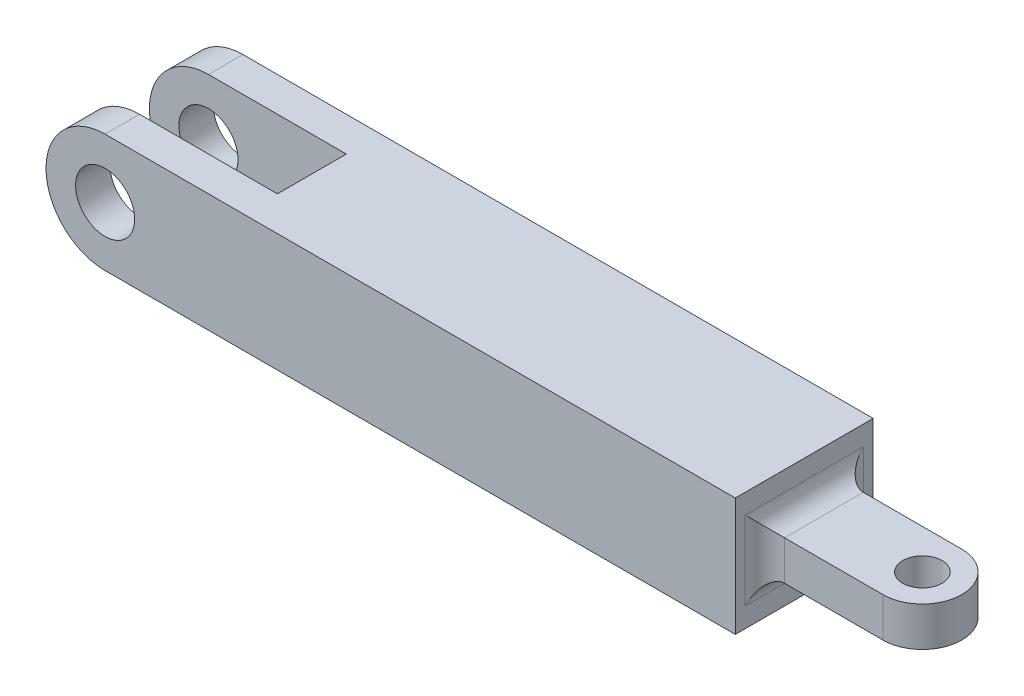
ISO-10303-21;
HEADER;
FILE_DESCRIPTION(('STEP AP214'),'2;1');
FILE_NAME('part.step','',(''),(''),'','','');
FILE_SCHEMA(('AUTOMOTIVE_DESIGN { 1 0 10303 214 1 1 1 1 }'));
ENDSEC;
DATA;
#1=APPLICATION_CONTEXT('core data for automotive mechanical design processes');
#2=APPLICATION_PROTOCOL_DEFINITION('international standard','automotive_design',2000,#1);
#3=PRODUCT_CONTEXT('',#1,'mechanical');
#4=PRODUCT('Part','Part','',(#3));
#5=PRODUCT_RELATED_PRODUCT_CATEGORY('part','',(#4));
#6=PRODUCT_DEFINITION_FORMATION('','',#4);
#7=PRODUCT_DEFINITION_CONTEXT('part definition',#1,'design');
#8=PRODUCT_DEFINITION('design','',#6,#7);
#9=PRODUCT_DEFINITION_SHAPE('','',#8);
#10=(LENGTH_UNIT() NAMED_UNIT(*) SI_UNIT(.MILLI.,.METRE.));
#11=(NAMED_UNIT(*) PLANE_ANGLE_UNIT() SI_UNIT($,.RADIAN.));
#12=(NAMED_UNIT(*) SI_UNIT($,.STERADIAN.) SOLID_ANGLE_UNIT());
#13=UNCERTAINTY_MEASURE_WITH_UNIT(LENGTH_MEASURE(1.E-05),#10,'distance_accuracy_value','');
#14=(GEOMETRIC_REPRESENTATION_CONTEXT(3) GLOBAL_UNCERTAINTY_ASSIGNED_CONTEXT((#13)) GLOBAL_UNIT_ASSIGNED_CONTEXT((#10,
#11,#12)) REPRESENTATION_CONTEXT('',''));
#15=CARTESIAN_POINT('',(0.,0.,0.));
#16=DIRECTION('',(0.,0.,1.));
#17=DIRECTION('',(1.,0.,0.));
#18=AXIS2_PLACEMENT_3D('',#15,#16,#17);
#19=CARTESIAN_POINT('',(-64.,6.,7.));
#20=DIRECTION('',(0.,0.,-1.));
#21=DIRECTION('',(-1.,0.,0.));
#22=AXIS2_PLACEMENT_3D('',#19,#20,#21);
#23=CYLINDRICAL_SURFACE('',#22,6.);
#24=CARTESIAN_POINT('',(-64.,6.,3.5));
#25=DIRECTION('',(0.,0.,-1.));
#26=DIRECTION('',(-1.,0.,0.));
#27=AXIS2_PLACEMENT_3D('',#24,#25,#26);
#28=CIRCLE('',#27,6.);
#29=CARTESIAN_POINT('',(-64.,0.,3.5));
#30=VERTEX_POINT('',#29);
#31=CARTESIAN_POINT('',(-64.,12.,3.5));
#32=VERTEX_POINT('',#31);
#33=EDGE_CURVE('E164',#30,#32,#28,.T.);
#34=ORIENTED_EDGE('',*,*,#33,.F.);
#35=DIRECTION('',(0.,0.,-1.));
#36=VECTOR('',#35,1.);
#37=CARTESIAN_POINT('',(-64.,0.,7.));
#38=LINE('',#37,#36);
#39=CARTESIAN_POINT('',(-64.,0.,7.));
#40=VERTEX_POINT('',#39);
#41=EDGE_CURVE('E217',#40,#30,#38,.T.);
#42=ORIENTED_EDGE('',*,*,#41,.F.);
#43=CARTESIAN_POINT('',(-64.,6.,7.));
#44=DIRECTION('',(0.,0.,1.));
#45=DIRECTION('',(1.,0.,0.));
#46=AXIS2_PLACEMENT_3D('',#43,#44,#45);
#47=CIRCLE('',#46,6.);
#48=CARTESIAN_POINT('',(-64.,12.,7.));
#49=VERTEX_POINT('',#48);
#50=EDGE_CURVE('E205',#49,#40,#47,.T.);
#51=ORIENTED_EDGE('',*,*,#50,.F.);
#52=DIRECTION('',(0.,0.,-1.));
#53=VECTOR('',#52,1.);
#54=CARTESIAN_POINT('',(-64.,12.,7.));
#55=LINE('',#54,#53);
#56=EDGE_CURVE('E221',#49,#32,#55,.T.);
#57=ORIENTED_EDGE('',*,*,#56,.T.);
#58=EDGE_LOOP('',(#34,#42,#51,#57));
#59=FACE_BOUND('',#58,.T.);
#60=ADVANCED_FACE('F43',(#59),#23,.T.);
#61=CARTESIAN_POINT('',(12.,4.,0.));
#62=DIRECTION('',(0.,1.,0.));
#63=DIRECTION('',(0.,0.,1.));
#64=AXIS2_PLACEMENT_3D('',#61,#62,#63);
#65=CYLINDRICAL_SURFACE('',#64,4.);
#66=DIRECTION('',(0.,1.,0.));
#67=VECTOR('',#66,1.);
#68=CARTESIAN_POINT('',(12.,4.,4.));
#69=LINE('',#68,#67);
#70=CARTESIAN_POINT('',(12.,4.,4.));
#71=VERTEX_POINT('',#70);
#72=CARTESIAN_POINT('',(12.,8.00000000000001,4.));
#73=VERTEX_POINT('',#72);
#74=EDGE_CURVE('E229',#71,#73,#69,.T.);
#75=ORIENTED_EDGE('',*,*,#74,.F.);
#76=CARTESIAN_POINT('',(12.,4.,0.));
#77=DIRECTION('',(0.,1.,0.));
#78=DIRECTION('',(0.,0.,1.));
#79=AXIS2_PLACEMENT_3D('',#76,#77,#78);
#80=CIRCLE('',#79,4.);
#81=CARTESIAN_POINT('',(12.,4.,-4.));
#82=VERTEX_POINT('',#81);
#83=EDGE_CURVE('E235',#82,#71,#80,.F.);
#84=ORIENTED_EDGE('',*,*,#83,.F.);
#85=DIRECTION('',(0.,-1.,0.));
#86=VECTOR('',#85,1.);
#87=CARTESIAN_POINT('',(12.,4.,-4.));
#88=LINE('',#87,#86);
#89=CARTESIAN_POINT('',(12.,8.00000000000001,-4.));
#90=VERTEX_POINT('',#89);
#91=EDGE_CURVE('E232',#90,#82,#88,.T.);
#92=ORIENTED_EDGE('',*,*,#91,.F.);
#93=CARTESIAN_POINT('',(12.,8.00000000000001,0.));
#94=DIRECTION('',(0.,1.,0.));
#95=DIRECTION('',(0.,0.,1.));
#96=AXIS2_PLACEMENT_3D('',#93,#94,#95);
#97=CIRCLE('',#96,4.);
#98=EDGE_CURVE('E237',#73,#90,#97,.T.);
#99=ORIENTED_EDGE('',*,*,#98,.F.);
#100=EDGE_LOOP('',(#75,#84,#92,#99));
#101=FACE_BOUND('',#100,.T.);
#102=ADVANCED_FACE('F326',(#101),#65,.T.);
#103=CARTESIAN_POINT('',(-64.,0.,7.));
#104=DIRECTION('',(0.,1.,0.));
#105=DIRECTION('',(0.,0.,1.));
#106=AXIS2_PLACEMENT_3D('',#103,#104,#105);
#107=PLANE('',#106);
#108=DIRECTION('',(0.,0.,-1.));
#109=VECTOR('',#108,1.);
#110=CARTESIAN_POINT('',(-50.,0.,7.));
#111=LINE('',#110,#109);
#112=CARTESIAN_POINT('',(-50.,0.,3.5));
#113=VERTEX_POINT('',#112);
#114=CARTESIAN_POINT('',(-50.,0.,-3.5));
#115=VERTEX_POINT('',#114);
#116=EDGE_CURVE('E154',#113,#115,#111,.T.);
#117=ORIENTED_EDGE('',*,*,#116,.T.);
#118=DIRECTION('',(-1.,0.,0.));
#119=VECTOR('',#118,1.);
#120=CARTESIAN_POINT('',(-64.,0.,-3.5));
#121=LINE('',#120,#119);
#122=CARTESIAN_POINT('',(-64.,0.,-3.5));
#123=VERTEX_POINT('',#122);
#124=EDGE_CURVE('E179',#115,#123,#121,.T.);
#125=ORIENTED_EDGE('',*,*,#124,.T.);
#126=CARTESIAN_POINT('',(-64.,0.,-7.));
#127=VERTEX_POINT('',#126);
#128=EDGE_CURVE('E207',#123,#127,#38,.T.);
#129=ORIENTED_EDGE('',*,*,#128,.T.);
#130=DIRECTION('',(1.,0.,0.));
#131=VECTOR('',#130,1.);
#132=CARTESIAN_POINT('',(-64.,0.,-7.));
#133=LINE('',#132,#131);
#134=CARTESIAN_POINT('',(0.,0.,-7.));
#135=VERTEX_POINT('',#134);
#136=EDGE_CURVE('E190',#127,#135,#133,.T.);
#137=ORIENTED_EDGE('',*,*,#136,.T.);
#138=DIRECTION('',(0.,0.,-1.));
#139=VECTOR('',#138,1.);
#140=CARTESIAN_POINT('',(0.,0.,7.));
#141=LINE('',#140,#139);
#142=CARTESIAN_POINT('',(0.,0.,7.));
#143=VERTEX_POINT('',#142);
#144=EDGE_CURVE('E226',#143,#135,#141,.T.);
#145=ORIENTED_EDGE('',*,*,#144,.F.);
#146=DIRECTION('',(1.,0.,0.));
#147=VECTOR('',#146,1.);
#148=CARTESIAN_POINT('',(-64.,0.,7.));
#149=LINE('',#148,#147);
#150=EDGE_CURVE('E197',#40,#143,#149,.T.);
#151=ORIENTED_EDGE('',*,*,#150,.F.);
#152=ORIENTED_EDGE('',*,*,#41,.T.);
#153=DIRECTION('',(-1.,0.,0.));
#154=VECTOR('',#153,1.);
#155=CARTESIAN_POINT('',(-64.,0.,3.5));
#156=LINE('',#155,#154);
#157=EDGE_CURVE('E176',#113,#30,#156,.T.);
#158=ORIENTED_EDGE('',*,*,#157,.F.);
#159=EDGE_LOOP('',(#117,#125,#129,#137,#145,#151,#152,#158));
#160=FACE_BOUND('',#159,.T.);
#161=ADVANCED_FACE('F302',(#160),#107,.F.);
#162=CARTESIAN_POINT('',(0.,0.,7.));
#163=DIRECTION('',(-1.,0.,0.));
#164=DIRECTION('',(0.,0.,1.));
#165=AXIS2_PLACEMENT_3D('',#162,#163,#164);
#166=PLANE('',#165);
#167=DIRECTION('',(0.,0.,-1.));
#168=VECTOR('',#167,1.);
#169=CARTESIAN_POINT('',(0.,2.,4.));
#170=LINE('',#169,#168);
#171=CARTESIAN_POINT('',(0.,2.,-6.));
#172=VERTEX_POINT('',#171);
#173=CARTESIAN_POINT('',(0.,2.,6.));
#174=VERTEX_POINT('',#173);
#175=EDGE_CURVE('E245',#172,#174,#170,.F.);
#176=ORIENTED_EDGE('',*,*,#175,.T.);
#177=DIRECTION('',(0.,1.,0.));
#178=VECTOR('',#177,1.);
#179=CARTESIAN_POINT('',(0.,0.,6.));
#180=LINE('',#179,#178);
#181=CARTESIAN_POINT('',(0.,10.,6.));
#182=VERTEX_POINT('',#181);
#183=EDGE_CURVE('E256',#174,#182,#180,.T.);
#184=ORIENTED_EDGE('',*,*,#183,.T.);
#185=DIRECTION('',(0.,0.,-1.));
#186=VECTOR('',#185,1.);
#187=CARTESIAN_POINT('',(0.,10.,7.));
#188=LINE('',#187,#186);
#189=CARTESIAN_POINT('',(0.,10.,-6.));
#190=VERTEX_POINT('',#189);
#191=EDGE_CURVE('E254',#182,#190,#188,.T.);
#192=ORIENTED_EDGE('',*,*,#191,.T.);
#193=DIRECTION('',(0.,1.,0.));
#194=VECTOR('',#193,1.);
#195=CARTESIAN_POINT('',(0.,4.,-6.));
#196=LINE('',#195,#194);
#197=EDGE_CURVE('E252',#190,#172,#196,.F.);
#198=ORIENTED_EDGE('',*,*,#197,.T.);
#199=EDGE_LOOP('',(#176,#184,#192,#198));
#200=FACE_BOUND('',#199,.T.);
#201=DIRECTION('',(0.,1.,0.));
#202=VECTOR('',#201,1.);
#203=CARTESIAN_POINT('',(0.,0.,-7.));
#204=LINE('',#203,#202);
#205=CARTESIAN_POINT('',(0.,12.,-7.));
#206=VERTEX_POINT('',#205);
#207=EDGE_CURVE('E210',#135,#206,#204,.T.);
#208=ORIENTED_EDGE('',*,*,#207,.T.);
#209=DIRECTION('',(0.,0.,-1.));
#210=VECTOR('',#209,1.);
#211=CARTESIAN_POINT('',(0.,12.,7.));
#212=LINE('',#211,#210);
#213=CARTESIAN_POINT('',(0.,12.,7.));
#214=VERTEX_POINT('',#213);
#215=EDGE_CURVE('E223',#214,#206,#212,.T.);
#216=ORIENTED_EDGE('',*,*,#215,.F.);
#217=DIRECTION('',(0.,1.,0.));
#218=VECTOR('',#217,1.);
#219=CARTESIAN_POINT('',(0.,0.,7.));
#220=LINE('',#219,#218);
#221=EDGE_CURVE('E200',#143,#214,#220,.T.);
#222=ORIENTED_EDGE('',*,*,#221,.F.);
#223=ORIENTED_EDGE('',*,*,#144,.T.);
#224=EDGE_LOOP('',(#208,#216,#222,#223));
#225=FACE_BOUND('',#224,.T.);
#226=ADVANCED_FACE('F305',(#200,#225),#166,.F.);
#227=CARTESIAN_POINT('',(0.,12.,7.));
#228=DIRECTION('',(0.,-1.,0.));
#229=DIRECTION('',(1.,0.,0.));
#230=AXIS2_PLACEMENT_3D('',#227,#228,#229);
#231=PLANE('',#230);
#232=CARTESIAN_POINT('',(-64.,12.,-3.5));
#233=VERTEX_POINT('',#232);
#234=CARTESIAN_POINT('',(-64.,12.,-7.));
#235=VERTEX_POINT('',#234);
#236=EDGE_CURVE('E220',#233,#235,#55,.T.);
#237=ORIENTED_EDGE('',*,*,#236,.F.);
#238=DIRECTION('',(-1.,0.,0.));
#239=VECTOR('',#238,1.);
#240=CARTESIAN_POINT('',(0.,12.,-3.5));
#241=LINE('',#240,#239);
#242=CARTESIAN_POINT('',(-50.,12.,-3.5));
#243=VERTEX_POINT('',#242);
#244=EDGE_CURVE('E158',#243,#233,#241,.T.);
#245=ORIENTED_EDGE('',*,*,#244,.F.);
#246=DIRECTION('',(0.,0.,-1.));
#247=VECTOR('',#246,1.);
#248=CARTESIAN_POINT('',(-50.,12.,0.));
#249=LINE('',#248,#247);
#250=CARTESIAN_POINT('',(-50.,12.,3.5));
#251=VERTEX_POINT('',#250);
#252=EDGE_CURVE('E151',#251,#243,#249,.T.);
#253=ORIENTED_EDGE('',*,*,#252,.F.);
#254=DIRECTION('',(-1.,0.,0.));
#255=VECTOR('',#254,1.);
#256=CARTESIAN_POINT('',(0.,12.,3.5));
#257=LINE('',#256,#255);
#258=EDGE_CURVE('E161',#251,#32,#257,.T.);
#259=ORIENTED_EDGE('',*,*,#258,.T.);
#260=ORIENTED_EDGE('',*,*,#56,.F.);
#261=DIRECTION('',(-1.,0.,0.));
#262=VECTOR('',#261,1.);
#263=CARTESIAN_POINT('',(0.,12.,7.));
#264=LINE('',#263,#262);
#265=EDGE_CURVE('E203',#214,#49,#264,.T.);
#266=ORIENTED_EDGE('',*,*,#265,.F.);
#267=ORIENTED_EDGE('',*,*,#215,.T.);
#268=DIRECTION('',(-1.,0.,0.));
#269=VECTOR('',#268,1.);
#270=CARTESIAN_POINT('',(0.,12.,-7.));
#271=LINE('',#270,#269);
#272=EDGE_CURVE('E212',#206,#235,#271,.T.);
#273=ORIENTED_EDGE('',*,*,#272,.T.);
#274=EDGE_LOOP('',(#237,#245,#253,#259,#260,#266,#267,#273));
#275=FACE_BOUND('',#274,.T.);
#276=ADVANCED_FACE('F171',(#275),#231,.F.);
#277=ORIENTED_EDGE('',*,*,#128,.F.);
#278=CARTESIAN_POINT('',(-64.,6.,-3.5));
#279=DIRECTION('',(0.,0.,-1.));
#280=DIRECTION('',(-1.,0.,0.));
#281=AXIS2_PLACEMENT_3D('',#278,#279,#280);
#282=CIRCLE('',#281,6.);
#283=EDGE_CURVE('E242',#123,#233,#282,.T.);
#284=ORIENTED_EDGE('',*,*,#283,.T.);
#285=ORIENTED_EDGE('',*,*,#236,.T.);
#286=CARTESIAN_POINT('',(-64.,6.,-7.));
#287=DIRECTION('',(0.,0.,1.));
#288=DIRECTION('',(1.,0.,0.));
#289=AXIS2_PLACEMENT_3D('',#286,#287,#288);
#290=CIRCLE('',#289,6.);
#291=EDGE_CURVE('E201',#235,#127,#290,.T.);
#292=ORIENTED_EDGE('',*,*,#291,.T.);
#293=EDGE_LOOP('',(#277,#284,#285,#292));
#294=FACE_BOUND('',#293,.T.);
#295=ADVANCED_FACE('F294',(#294),#23,.T.);
#296=CARTESIAN_POINT('',(-64.,6.,7.));
#297=DIRECTION('',(0.,0.,1.));
#298=DIRECTION('',(1.,0.,0.));
#299=AXIS2_PLACEMENT_3D('',#296,#297,#298);
#300=PLANE('',#299);
#301=CARTESIAN_POINT('',(-64.,6.,7.));
#302=DIRECTION('',(0.,0.,1.));
#303=DIRECTION('',(1.,0.,0.));
#304=AXIS2_PLACEMENT_3D('',#301,#302,#303);
#305=CIRCLE('',#304,3.);
#306=CARTESIAN_POINT('',(-61.,6.,7.));
#307=VERTEX_POINT('',#306);
#308=EDGE_CURVE('E168',#307,#307,#305,.T.);
#309=ORIENTED_EDGE('',*,*,#308,.F.);
#310=EDGE_LOOP('',(#309));
#311=FACE_BOUND('',#310,.T.);
#312=ORIENTED_EDGE('',*,*,#150,.T.);
#313=ORIENTED_EDGE('',*,*,#221,.T.);
#314=ORIENTED_EDGE('',*,*,#265,.T.);
#315=ORIENTED_EDGE('',*,*,#50,.T.);
#316=EDGE_LOOP('',(#312,#313,#314,#315));
#317=FACE_BOUND('',#316,.T.);
#318=ADVANCED_FACE('F290',(#311,#317),#300,.T.);
#319=CARTESIAN_POINT('',(-64.,6.,-7.));
#320=DIRECTION('',(0.,0.,1.));
#321=DIRECTION('',(1.,0.,0.));
#322=AXIS2_PLACEMENT_3D('',#319,#320,#321);
#323=PLANE('',#322);
#324=CARTESIAN_POINT('',(-64.,6.,-7.));
#325=DIRECTION('',(0.,0.,1.));
#326=DIRECTION('',(1.,0.,0.));
#327=AXIS2_PLACEMENT_3D('',#324,#325,#326);
#328=CIRCLE('',#327,3.);
#329=CARTESIAN_POINT('',(-61.,6.,-7.));
#330=VERTEX_POINT('',#329);
#331=EDGE_CURVE('E250',#330,#330,#328,.T.);
#332=ORIENTED_EDGE('',*,*,#331,.T.);
#333=EDGE_LOOP('',(#332));
#334=FACE_BOUND('',#333,.T.);
#335=ORIENTED_EDGE('',*,*,#136,.F.);
#336=ORIENTED_EDGE('',*,*,#291,.F.);
#337=ORIENTED_EDGE('',*,*,#272,.F.);
#338=ORIENTED_EDGE('',*,*,#207,.F.);
#339=EDGE_LOOP('',(#335,#336,#337,#338));
#340=FACE_BOUND('',#339,.T.);
#341=ADVANCED_FACE('F293',(#334,#340),#323,.F.);
#342=CARTESIAN_POINT('',(16.,8.00000000000001,4.));
#343=DIRECTION('',(0.,1.,0.));
#344=DIRECTION('',(0.,0.,1.));
#345=AXIS2_PLACEMENT_3D('',#342,#343,#344);
#346=PLANE('',#345);
#347=CARTESIAN_POINT('',(12.,8.00000000000001,0.));
#348=DIRECTION('',(0.,1.,0.));
#349=DIRECTION('',(0.,0.,1.));
#350=AXIS2_PLACEMENT_3D('',#347,#348,#349);
#351=CIRCLE('',#350,2.);
#352=CARTESIAN_POINT('',(12.,8.00000000000001,2.));
#353=VERTEX_POINT('',#352);
#354=EDGE_CURVE('E183',#353,#353,#351,.T.);
#355=ORIENTED_EDGE('',*,*,#354,.F.);
#356=EDGE_LOOP('',(#355));
#357=FACE_BOUND('',#356,.T.);
#358=DIRECTION('',(-1.,0.,0.));
#359=VECTOR('',#358,1.);
#360=CARTESIAN_POINT('',(16.,8.00000000000001,-4.));
#361=LINE('',#360,#359);
#362=CARTESIAN_POINT('',(2.,8.00000000000001,-4.));
#363=VERTEX_POINT('',#362);
#364=EDGE_CURVE('E195',#90,#363,#361,.T.);
#365=ORIENTED_EDGE('',*,*,#364,.T.);
#366=DIRECTION('',(0.,0.,-1.));
#367=VECTOR('',#366,1.);
#368=CARTESIAN_POINT('',(2.,8.00000000000001,4.));
#369=LINE('',#368,#367);
#370=CARTESIAN_POINT('',(2.,8.00000000000001,4.));
#371=VERTEX_POINT('',#370);
#372=EDGE_CURVE('E262',#363,#371,#369,.F.);
#373=ORIENTED_EDGE('',*,*,#372,.T.);
#374=DIRECTION('',(-1.,0.,0.));
#375=VECTOR('',#374,1.);
#376=CARTESIAN_POINT('',(16.,8.00000000000001,4.));
#377=LINE('',#376,#375);
#378=EDGE_CURVE('E187',#73,#371,#377,.T.);
#379=ORIENTED_EDGE('',*,*,#378,.F.);
#380=ORIENTED_EDGE('',*,*,#98,.T.);
#381=EDGE_LOOP('',(#365,#373,#379,#380));
#382=FACE_BOUND('',#381,.T.);
#383=ADVANCED_FACE('F315',(#357,#382),#346,.T.);
#384=CARTESIAN_POINT('',(16.,4.,4.));
#385=DIRECTION('',(0.,0.,1.));
#386=DIRECTION('',(1.,0.,0.));
#387=AXIS2_PLACEMENT_3D('',#384,#385,#386);
#388=PLANE('',#387);
#389=ORIENTED_EDGE('',*,*,#378,.T.);
#390=DIRECTION('',(0.,1.,0.));
#391=VECTOR('',#390,1.);
#392=CARTESIAN_POINT('',(2.,4.,4.));
#393=LINE('',#392,#391);
#394=CARTESIAN_POINT('',(2.,4.,4.));
#395=VERTEX_POINT('',#394);
#396=EDGE_CURVE('E259',#371,#395,#393,.F.);
#397=ORIENTED_EDGE('',*,*,#396,.T.);
#398=DIRECTION('',(-1.,0.,0.));
#399=VECTOR('',#398,1.);
#400=CARTESIAN_POINT('',(16.,4.,4.));
#401=LINE('',#400,#399);
#402=EDGE_CURVE('E191',#71,#395,#401,.T.);
#403=ORIENTED_EDGE('',*,*,#402,.F.);
#404=ORIENTED_EDGE('',*,*,#74,.T.);
#405=EDGE_LOOP('',(#389,#397,#403,#404));
#406=FACE_BOUND('',#405,.T.);
#407=ADVANCED_FACE('F321',(#406),#388,.T.);
#408=CARTESIAN_POINT('',(16.,4.,4.));
#409=DIRECTION('',(0.,1.,0.));
#410=DIRECTION('',(0.,0.,1.));
#411=AXIS2_PLACEMENT_3D('',#408,#409,#410);
#412=PLANE('',#411);
#413=CARTESIAN_POINT('',(12.,4.,0.));
#414=DIRECTION('',(0.,1.,0.));
#415=DIRECTION('',(0.,0.,1.));
#416=AXIS2_PLACEMENT_3D('',#413,#414,#415);
#417=CIRCLE('',#416,2.);
#418=CARTESIAN_POINT('',(12.,4.,2.));
#419=VERTEX_POINT('',#418);
#420=EDGE_CURVE('E186',#419,#419,#417,.T.);
#421=ORIENTED_EDGE('',*,*,#420,.T.);
#422=EDGE_LOOP('',(#421));
#423=FACE_BOUND('',#422,.T.);
#424=ORIENTED_EDGE('',*,*,#402,.T.);
#425=DIRECTION('',(0.,0.,-1.));
#426=VECTOR('',#425,1.);
#427=CARTESIAN_POINT('',(2.,4.,-4.));
#428=LINE('',#427,#426);
#429=CARTESIAN_POINT('',(2.,4.,-4.));
#430=VERTEX_POINT('',#429);
#431=EDGE_CURVE('E11',#395,#430,#428,.T.);
#432=ORIENTED_EDGE('',*,*,#431,.T.);
#433=DIRECTION('',(-1.,0.,0.));
#434=VECTOR('',#433,1.);
#435=CARTESIAN_POINT('',(16.,4.,-4.));
#436=LINE('',#435,#434);
#437=EDGE_CURVE('E193',#82,#430,#436,.T.);
#438=ORIENTED_EDGE('',*,*,#437,.F.);
#439=ORIENTED_EDGE('',*,*,#83,.T.);
#440=EDGE_LOOP('',(#424,#432,#438,#439));
#441=FACE_BOUND('',#440,.T.);
#442=ADVANCED_FACE('F382',(#423,#441),#412,.F.);
#443=CARTESIAN_POINT('',(16.,4.,-4.));
#444=DIRECTION('',(0.,0.,1.));
#445=DIRECTION('',(1.,0.,0.));
#446=AXIS2_PLACEMENT_3D('',#443,#444,#445);
#447=PLANE('',#446);
#448=ORIENTED_EDGE('',*,*,#437,.T.);
#449=DIRECTION('',(0.,1.,0.));
#450=VECTOR('',#449,1.);
#451=CARTESIAN_POINT('',(2.,8.00000000000001,-4.));
#452=LINE('',#451,#450);
#453=EDGE_CURVE('E52',#430,#363,#452,.T.);
#454=ORIENTED_EDGE('',*,*,#453,.T.);
#455=ORIENTED_EDGE('',*,*,#364,.F.);
#456=ORIENTED_EDGE('',*,*,#91,.T.);
#457=EDGE_LOOP('',(#448,#454,#455,#456));
#458=FACE_BOUND('',#457,.T.);
#459=ADVANCED_FACE('F380',(#458),#447,.F.);
#460=CARTESIAN_POINT('',(12.,-7.99999999999999,0.));
#461=DIRECTION('',(0.,1.,0.));
#462=DIRECTION('',(0.,0.,1.));
#463=AXIS2_PLACEMENT_3D('',#460,#461,#462);
#464=CYLINDRICAL_SURFACE('',#463,2.);
#465=ORIENTED_EDGE('',*,*,#354,.T.);
#466=EDGE_LOOP('',(#465));
#467=FACE_BOUND('',#466,.T.);
#468=ORIENTED_EDGE('',*,*,#420,.F.);
#469=EDGE_LOOP('',(#468));
#470=FACE_BOUND('',#469,.T.);
#471=ADVANCED_FACE('F381',(#467,#470),#464,.F.);
#472=CARTESIAN_POINT('',(-50.,-21.,0.));
#473=DIRECTION('',(1.,0.,0.));
#474=DIRECTION('',(0.,1.,0.));
#475=AXIS2_PLACEMENT_3D('',#472,#473,#474);
#476=PLANE('',#475);
#477=DIRECTION('',(0.,1.,0.));
#478=VECTOR('',#477,1.);
#479=CARTESIAN_POINT('',(-50.,-21.,3.5));
#480=LINE('',#479,#478);
#481=EDGE_CURVE('E146',#113,#251,#480,.T.);
#482=ORIENTED_EDGE('',*,*,#481,.T.);
#483=ORIENTED_EDGE('',*,*,#252,.T.);
#484=DIRECTION('',(0.,1.,0.));
#485=VECTOR('',#484,1.);
#486=CARTESIAN_POINT('',(-50.,-21.,-3.5));
#487=LINE('',#486,#485);
#488=EDGE_CURVE('E157',#115,#243,#487,.T.);
#489=ORIENTED_EDGE('',*,*,#488,.F.);
#490=ORIENTED_EDGE('',*,*,#116,.F.);
#491=EDGE_LOOP('',(#482,#483,#489,#490));
#492=FACE_BOUND('',#491,.T.);
#493=ADVANCED_FACE('F148',(#492),#476,.F.);
#494=CARTESIAN_POINT('',(0.,-21.,-3.5));
#495=DIRECTION('',(0.,0.,-1.));
#496=DIRECTION('',(-1.,0.,0.));
#497=AXIS2_PLACEMENT_3D('',#494,#495,#496);
#498=PLANE('',#497);
#499=CARTESIAN_POINT('',(-64.,6.,-3.5));
#500=DIRECTION('',(0.,0.,-1.));
#501=DIRECTION('',(-1.,0.,0.));
#502=AXIS2_PLACEMENT_3D('',#499,#500,#501);
#503=CIRCLE('',#502,3.);
#504=CARTESIAN_POINT('',(-67.,6.,-3.5));
#505=VERTEX_POINT('',#504);
#506=EDGE_CURVE('E249',#505,#505,#503,.T.);
#507=ORIENTED_EDGE('',*,*,#506,.T.);
#508=EDGE_LOOP('',(#507));
#509=FACE_BOUND('',#508,.T.);
#510=ORIENTED_EDGE('',*,*,#488,.T.);
#511=ORIENTED_EDGE('',*,*,#244,.T.);
#512=ORIENTED_EDGE('',*,*,#283,.F.);
#513=ORIENTED_EDGE('',*,*,#124,.F.);
#514=EDGE_LOOP('',(#510,#511,#512,#513));
#515=FACE_BOUND('',#514,.T.);
#516=ADVANCED_FACE('F396',(#509,#515),#498,.F.);
#517=CARTESIAN_POINT('',(0.,-21.,3.5));
#518=DIRECTION('',(0.,0.,-1.));
#519=DIRECTION('',(-1.,0.,0.));
#520=AXIS2_PLACEMENT_3D('',#517,#518,#519);
#521=PLANE('',#520);
#522=CARTESIAN_POINT('',(-64.,6.,3.5));
#523=DIRECTION('',(0.,0.,-1.));
#524=DIRECTION('',(-1.,0.,0.));
#525=AXIS2_PLACEMENT_3D('',#522,#523,#524);
#526=CIRCLE('',#525,3.);
#527=CARTESIAN_POINT('',(-67.,6.,3.5));
#528=VERTEX_POINT('',#527);
#529=EDGE_CURVE('E246',#528,#528,#526,.T.);
#530=ORIENTED_EDGE('',*,*,#529,.F.);
#531=EDGE_LOOP('',(#530));
#532=FACE_BOUND('',#531,.T.);
#533=ORIENTED_EDGE('',*,*,#157,.T.);
#534=ORIENTED_EDGE('',*,*,#33,.T.);
#535=ORIENTED_EDGE('',*,*,#258,.F.);
#536=ORIENTED_EDGE('',*,*,#481,.F.);
#537=EDGE_LOOP('',(#533,#534,#535,#536));
#538=FACE_BOUND('',#537,.T.);
#539=ADVANCED_FACE('F162',(#532,#538),#521,.T.);
#540=CARTESIAN_POINT('',(-64.,6.,-7.));
#541=DIRECTION('',(0.,0.,1.));
#542=DIRECTION('',(1.,0.,0.));
#543=AXIS2_PLACEMENT_3D('',#540,#541,#542);
#544=CYLINDRICAL_SURFACE('',#543,3.);
#545=ORIENTED_EDGE('',*,*,#308,.T.);
#546=EDGE_LOOP('',(#545));
#547=FACE_BOUND('',#546,.T.);
#548=ORIENTED_EDGE('',*,*,#529,.T.);
#549=EDGE_LOOP('',(#548));
#550=FACE_BOUND('',#549,.T.);
#551=ADVANCED_FACE('F287',(#547,#550),#544,.F.);
#552=ORIENTED_EDGE('',*,*,#331,.F.);
#553=EDGE_LOOP('',(#552));
#554=FACE_BOUND('',#553,.T.);
#555=ORIENTED_EDGE('',*,*,#506,.F.);
#556=EDGE_LOOP('',(#555));
#557=FACE_BOUND('',#556,.T.);
#558=ADVANCED_FACE('F361',(#554,#557),#544,.F.);
#559=CARTESIAN_POINT('',(2.,4.,-6.));
#560=DIRECTION('',(0.,-1.,0.));
#561=DIRECTION('',(0.,0.,-1.));
#562=AXIS2_PLACEMENT_3D('',#559,#560,#561);
#563=CYLINDRICAL_SURFACE('',#562,2.);
#564=CARTESIAN_POINT('',(2.,10.,-6.));
#565=DIRECTION('',(0.,-0.707106781186547,-0.707106781186547));
#566=DIRECTION('',(0.,-0.707106781186547,0.707106781186547));
#567=AXIS2_PLACEMENT_3D('',#564,#565,#566);
#568=ELLIPSE('',#567,2.82842712474619,2.);
#569=EDGE_CURVE('E268',#363,#190,#568,.T.);
#570=ORIENTED_EDGE('',*,*,#569,.F.);
#571=ORIENTED_EDGE('',*,*,#453,.F.);
#572=CARTESIAN_POINT('',(2.,2.,-6.));
#573=DIRECTION('',(0.,-0.707106781186547,0.707106781186547));
#574=DIRECTION('',(0.,0.707106781186547,0.707106781186547));
#575=AXIS2_PLACEMENT_3D('',#572,#573,#574);
#576=ELLIPSE('',#575,2.82842712474619,2.);
#577=EDGE_CURVE('E47',#172,#430,#576,.F.);
#578=ORIENTED_EDGE('',*,*,#577,.F.);
#579=ORIENTED_EDGE('',*,*,#197,.F.);
#580=EDGE_LOOP('',(#570,#571,#578,#579));
#581=FACE_BOUND('',#580,.T.);
#582=ADVANCED_FACE('F45',(#581),#563,.F.);
#583=CARTESIAN_POINT('',(2.,2.,4.));
#584=DIRECTION('',(0.,0.,1.));
#585=DIRECTION('',(1.,0.,0.));
#586=AXIS2_PLACEMENT_3D('',#583,#584,#585);
#587=CYLINDRICAL_SURFACE('',#586,2.);
#588=ORIENTED_EDGE('',*,*,#577,.T.);
#589=ORIENTED_EDGE('',*,*,#431,.F.);
#590=CARTESIAN_POINT('',(2.,2.,6.));
#591=DIRECTION('',(0.,0.707106781186547,0.707106781186547));
#592=DIRECTION('',(0.,-0.707106781186547,0.707106781186547));
#593=AXIS2_PLACEMENT_3D('',#590,#591,#592);
#594=ELLIPSE('',#593,2.82842712474619,2.);
#595=EDGE_CURVE('E267',#174,#395,#594,.F.);
#596=ORIENTED_EDGE('',*,*,#595,.F.);
#597=ORIENTED_EDGE('',*,*,#175,.F.);
#598=EDGE_LOOP('',(#588,#589,#596,#597));
#599=FACE_BOUND('',#598,.T.);
#600=ADVANCED_FACE('F356',(#599),#587,.F.);
#601=CARTESIAN_POINT('',(2.,10.,7.));
#602=DIRECTION('',(0.,0.,-1.));
#603=DIRECTION('',(-1.,0.,0.));
#604=AXIS2_PLACEMENT_3D('',#601,#602,#603);
#605=CYLINDRICAL_SURFACE('',#604,2.);
#606=ORIENTED_EDGE('',*,*,#569,.T.);
#607=ORIENTED_EDGE('',*,*,#191,.F.);
#608=CARTESIAN_POINT('',(2.,10.,6.));
#609=DIRECTION('',(0.,0.707106781186547,-0.707106781186547));
#610=DIRECTION('',(0.,-0.707106781186547,-0.707106781186547));
#611=AXIS2_PLACEMENT_3D('',#608,#609,#610);
#612=ELLIPSE('',#611,2.82842712474619,2.);
#613=EDGE_CURVE('E265',#371,#182,#612,.T.);
#614=ORIENTED_EDGE('',*,*,#613,.F.);
#615=ORIENTED_EDGE('',*,*,#372,.F.);
#616=EDGE_LOOP('',(#606,#607,#614,#615));
#617=FACE_BOUND('',#616,.T.);
#618=ADVANCED_FACE('F353',(#617),#605,.F.);
#619=CARTESIAN_POINT('',(2.,0.,6.));
#620=DIRECTION('',(0.,1.,0.));
#621=DIRECTION('',(0.,0.,1.));
#622=AXIS2_PLACEMENT_3D('',#619,#620,#621);
#623=CYLINDRICAL_SURFACE('',#622,2.);
#624=ORIENTED_EDGE('',*,*,#595,.T.);
#625=ORIENTED_EDGE('',*,*,#396,.F.);
#626=ORIENTED_EDGE('',*,*,#613,.T.);
#627=ORIENTED_EDGE('',*,*,#183,.F.);
#628=EDGE_LOOP('',(#624,#625,#626,#627));
#629=FACE_BOUND('',#628,.T.);
#630=ADVANCED_FACE('F350',(#629),#623,.F.);
#631=CLOSED_SHELL('',(#60,#102,#161,#226,#276,#295,#318,#341,#383,#407,#442,#459,#471,#493,#516,
#539,#551,#558,#582,#600,#618,#630));
#632=MANIFOLD_SOLID_BREP('B2',#631);
#633=ADVANCED_BREP_SHAPE_REPRESENTATION('',(#18,#632),#14);
#634=SHAPE_DEFINITION_REPRESENTATION(#9,#633);
ENDSEC;
END-ISO-10303-21;
